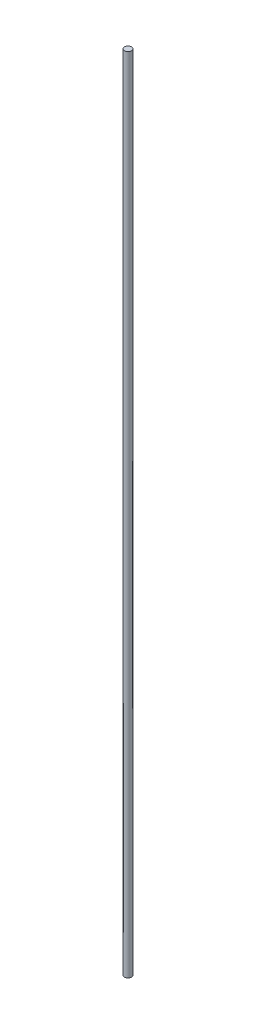
ISO-10303-21;
HEADER;
FILE_DESCRIPTION(('STEP AP214'),'2;1');
FILE_NAME('part.step','',(''),(''),'','','');
FILE_SCHEMA(('AUTOMOTIVE_DESIGN { 1 0 10303 214 1 1 1 1 }'));
ENDSEC;
DATA;
#1=APPLICATION_CONTEXT('core data for automotive mechanical design processes');
#2=APPLICATION_PROTOCOL_DEFINITION('international standard','automotive_design',2000,#1);
#3=PRODUCT_CONTEXT('',#1,'mechanical');
#4=PRODUCT('Part','Part','',(#3));
#5=PRODUCT_RELATED_PRODUCT_CATEGORY('part','',(#4));
#6=PRODUCT_DEFINITION_FORMATION('','',#4);
#7=PRODUCT_DEFINITION_CONTEXT('part definition',#1,'design');
#8=PRODUCT_DEFINITION('design','',#6,#7);
#9=PRODUCT_DEFINITION_SHAPE('','',#8);
#10=(LENGTH_UNIT() NAMED_UNIT(*) SI_UNIT(.MILLI.,.METRE.));
#11=(NAMED_UNIT(*) PLANE_ANGLE_UNIT() SI_UNIT($,.RADIAN.));
#12=(NAMED_UNIT(*) SI_UNIT($,.STERADIAN.) SOLID_ANGLE_UNIT());
#13=UNCERTAINTY_MEASURE_WITH_UNIT(LENGTH_MEASURE(1.E-05),#10,'distance_accuracy_value','');
#14=(GEOMETRIC_REPRESENTATION_CONTEXT(3) GLOBAL_UNCERTAINTY_ASSIGNED_CONTEXT((#13)) GLOBAL_UNIT_ASSIGNED_CONTEXT((#10,
#11,#12)) REPRESENTATION_CONTEXT('',''));
#15=CARTESIAN_POINT('',(0.,0.,0.));
#16=DIRECTION('',(0.,0.,1.));
#17=DIRECTION('',(1.,0.,0.));
#18=AXIS2_PLACEMENT_3D('',#15,#16,#17);
#19=CARTESIAN_POINT('',(0.,-1.,0.));
#20=DIRECTION('',(0.,1.,0.));
#21=DIRECTION('',(0.,0.,1.));
#22=AXIS2_PLACEMENT_3D('',#19,#20,#21);
#23=PLANE('',#22);
#24=CARTESIAN_POINT('',(0.,-1.,0.));
#25=DIRECTION('',(0.,-1.,0.));
#26=DIRECTION('',(0.,0.,-1.));
#27=AXIS2_PLACEMENT_3D('',#24,#25,#26);
#28=CIRCLE('',#27,0.75);
#29=CARTESIAN_POINT('',(0.,-1.,-0.75));
#30=VERTEX_POINT('',#29);
#31=EDGE_CURVE('E10',#30,#30,#28,.T.);
#32=ORIENTED_EDGE('',*,*,#31,.F.);
#33=EDGE_LOOP('',(#32));
#34=FACE_BOUND('',#33,.T.);
#35=ADVANCED_FACE('F31',(#34),#23,.T.);
#36=CARTESIAN_POINT('',(0.,-179.,0.));
#37=DIRECTION('',(0.,-1.,0.));
#38=DIRECTION('',(0.,0.,-1.));
#39=AXIS2_PLACEMENT_3D('',#36,#37,#38);
#40=CYLINDRICAL_SURFACE('',#39,0.75);
#41=ORIENTED_EDGE('',*,*,#31,.T.);
#42=EDGE_LOOP('',(#41));
#43=FACE_BOUND('',#42,.T.);
#44=CARTESIAN_POINT('',(0.,-175.,0.));
#45=DIRECTION('',(0.,-1.,0.));
#46=DIRECTION('',(0.,0.,-1.));
#47=AXIS2_PLACEMENT_3D('',#44,#45,#46);
#48=CIRCLE('',#47,0.75);
#49=CARTESIAN_POINT('',(0.,-175.,-0.75));
#50=VERTEX_POINT('',#49);
#51=EDGE_CURVE('E37',#50,#50,#48,.T.);
#52=ORIENTED_EDGE('',*,*,#51,.F.);
#53=EDGE_LOOP('',(#52));
#54=FACE_BOUND('',#53,.T.);
#55=ADVANCED_FACE('F45',(#43,#54),#40,.T.);
#56=CARTESIAN_POINT('',(0.75,-175.,0.));
#57=DIRECTION('',(0.,-1.,0.));
#58=DIRECTION('',(0.,0.,-1.));
#59=AXIS2_PLACEMENT_3D('',#56,#57,#58);
#60=PLANE('',#59);
#61=ORIENTED_EDGE('',*,*,#51,.T.);
#62=EDGE_LOOP('',(#61));
#63=FACE_BOUND('',#62,.T.);
#64=ADVANCED_FACE('F43',(#63),#60,.T.);
#65=CLOSED_SHELL('',(#35,#55,#64));
#66=MANIFOLD_SOLID_BREP('B2',#65);
#67=ADVANCED_BREP_SHAPE_REPRESENTATION('',(#18,#66),#14);
#68=SHAPE_DEFINITION_REPRESENTATION(#9,#67);
ENDSEC;
END-ISO-10303-21;
